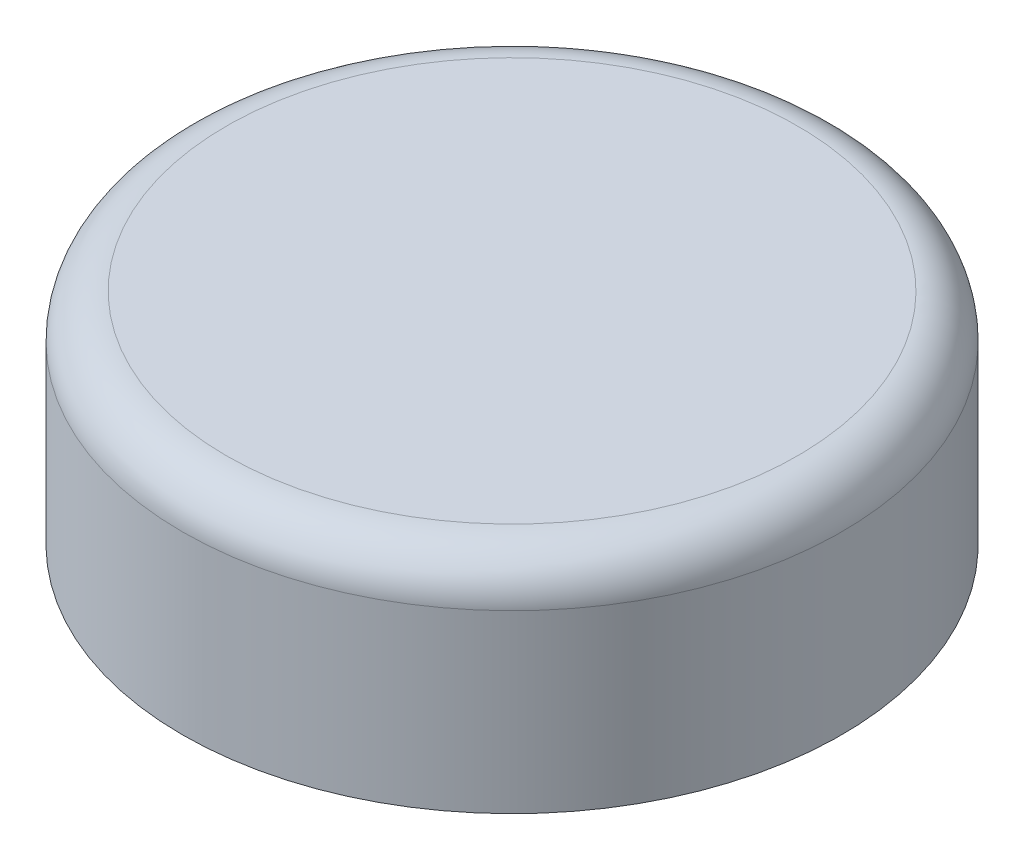
ISO-10303-21;
HEADER;
FILE_DESCRIPTION(('STEP AP214'),'2;1');
FILE_NAME('part.step','',(''),(''),'','','');
FILE_SCHEMA(('AUTOMOTIVE_DESIGN { 1 0 10303 214 1 1 1 1 }'));
ENDSEC;
DATA;
#1=APPLICATION_CONTEXT('core data for automotive mechanical design processes');
#2=APPLICATION_PROTOCOL_DEFINITION('international standard','automotive_design',2000,#1);
#3=PRODUCT_CONTEXT('',#1,'mechanical');
#4=PRODUCT('Part','Part','',(#3));
#5=PRODUCT_RELATED_PRODUCT_CATEGORY('part','',(#4));
#6=PRODUCT_DEFINITION_FORMATION('','',#4);
#7=PRODUCT_DEFINITION_CONTEXT('part definition',#1,'design');
#8=PRODUCT_DEFINITION('design','',#6,#7);
#9=PRODUCT_DEFINITION_SHAPE('','',#8);
#10=(LENGTH_UNIT() NAMED_UNIT(*) SI_UNIT(.MILLI.,.METRE.));
#11=(NAMED_UNIT(*) PLANE_ANGLE_UNIT() SI_UNIT($,.RADIAN.));
#12=(NAMED_UNIT(*) SI_UNIT($,.STERADIAN.) SOLID_ANGLE_UNIT());
#13=UNCERTAINTY_MEASURE_WITH_UNIT(LENGTH_MEASURE(1.E-05),#10,'distance_accuracy_value','');
#14=(GEOMETRIC_REPRESENTATION_CONTEXT(3) GLOBAL_UNCERTAINTY_ASSIGNED_CONTEXT((#13)) GLOBAL_UNIT_ASSIGNED_CONTEXT((#10,
#11,#12)) REPRESENTATION_CONTEXT('',''));
#15=CARTESIAN_POINT('',(0.,0.,0.));
#16=DIRECTION('',(0.,0.,1.));
#17=DIRECTION('',(1.,0.,0.));
#18=AXIS2_PLACEMENT_3D('',#15,#16,#17);
#19=CARTESIAN_POINT('',(0.,0.,0.));
#20=DIRECTION('',(0.,1.,0.));
#21=DIRECTION('',(0.,0.,1.));
#22=AXIS2_PLACEMENT_3D('',#19,#20,#21);
#23=PLANE('',#22);
#24=CARTESIAN_POINT('',(0.,0.,0.));
#25=DIRECTION('',(0.,1.,0.));
#26=DIRECTION('',(0.,0.,1.));
#27=AXIS2_PLACEMENT_3D('',#24,#25,#26);
#28=CIRCLE('',#27,15.);
#29=CARTESIAN_POINT('',(0.,0.,15.));
#30=VERTEX_POINT('',#29);
#31=EDGE_CURVE('E51',#30,#30,#28,.T.);
#32=ORIENTED_EDGE('',*,*,#31,.F.);
#33=EDGE_LOOP('',(#32));
#34=FACE_BOUND('',#33,.T.);
#35=CARTESIAN_POINT('',(0.,0.,0.));
#36=DIRECTION('',(0.,1.,0.));
#37=DIRECTION('',(0.,0.,1.));
#38=AXIS2_PLACEMENT_3D('',#35,#36,#37);
#39=CIRCLE('',#38,3.1);
#40=CARTESIAN_POINT('',(1.55,0.,-2.68467875173176));
#41=VERTEX_POINT('',#40);
#42=CARTESIAN_POINT('',(1.55,0.,2.68467875173176));
#43=VERTEX_POINT('',#42);
#44=EDGE_CURVE('E60',#41,#43,#39,.T.);
#45=ORIENTED_EDGE('',*,*,#44,.T.);
#46=DIRECTION('',(0.,0.,-1.));
#47=VECTOR('',#46,1.);
#48=CARTESIAN_POINT('',(1.55,0.,-2.68467875173176));
#49=LINE('',#48,#47);
#50=EDGE_CURVE('E75',#43,#41,#49,.T.);
#51=ORIENTED_EDGE('',*,*,#50,.T.);
#52=EDGE_LOOP('',(#45,#51));
#53=FACE_BOUND('',#52,.T.);
#54=ADVANCED_FACE('F42',(#34,#53),#23,.F.);
#55=CARTESIAN_POINT('',(0.,10.,0.));
#56=DIRECTION('',(0.,1.,0.));
#57=DIRECTION('',(0.,0.,1.));
#58=AXIS2_PLACEMENT_3D('',#55,#56,#57);
#59=CYLINDRICAL_SURFACE('',#58,15.);
#60=CARTESIAN_POINT('',(0.,8.,0.));
#61=DIRECTION('',(0.,1.,0.));
#62=DIRECTION('',(0.,0.,1.));
#63=AXIS2_PLACEMENT_3D('',#60,#61,#62);
#64=CIRCLE('',#63,15.);
#65=CARTESIAN_POINT('',(0.,8.,15.));
#66=VERTEX_POINT('',#65);
#67=EDGE_CURVE('E11',#66,#66,#64,.T.);
#68=ORIENTED_EDGE('',*,*,#67,.F.);
#69=EDGE_LOOP('',(#68));
#70=FACE_BOUND('',#69,.T.);
#71=ORIENTED_EDGE('',*,*,#31,.T.);
#72=EDGE_LOOP('',(#71));
#73=FACE_BOUND('',#72,.T.);
#74=ADVANCED_FACE('F102',(#70,#73),#59,.T.);
#75=CARTESIAN_POINT('',(0.,8.,0.));
#76=DIRECTION('',(0.,1.,0.));
#77=DIRECTION('',(0.,0.,1.));
#78=AXIS2_PLACEMENT_3D('',#75,#76,#77);
#79=TOROIDAL_SURFACE('',#78,13.,2.);
#80=CARTESIAN_POINT('',(0.,10.,0.));
#81=DIRECTION('',(0.,1.,0.));
#82=DIRECTION('',(0.,0.,1.));
#83=AXIS2_PLACEMENT_3D('',#80,#81,#82);
#84=CIRCLE('',#83,13.);
#85=CARTESIAN_POINT('',(0.,10.,13.));
#86=VERTEX_POINT('',#85);
#87=EDGE_CURVE('E87',#86,#86,#84,.T.);
#88=ORIENTED_EDGE('',*,*,#87,.F.);
#89=EDGE_LOOP('',(#88));
#90=FACE_BOUND('',#89,.T.);
#91=ORIENTED_EDGE('',*,*,#67,.T.);
#92=EDGE_LOOP('',(#91));
#93=FACE_BOUND('',#92,.T.);
#94=ADVANCED_FACE('F44',(#90,#93),#79,.T.);
#95=CARTESIAN_POINT('',(0.,10.,0.));
#96=DIRECTION('',(0.,-1.,0.));
#97=DIRECTION('',(0.,0.,-1.));
#98=AXIS2_PLACEMENT_3D('',#95,#96,#97);
#99=PLANE('',#98);
#100=ORIENTED_EDGE('',*,*,#87,.T.);
#101=EDGE_LOOP('',(#100));
#102=FACE_BOUND('',#101,.T.);
#103=ADVANCED_FACE('F106',(#102),#99,.F.);
#104=CARTESIAN_POINT('',(0.,7.5,0.));
#105=DIRECTION('',(0.,-1.,0.));
#106=DIRECTION('',(0.,0.,-1.));
#107=AXIS2_PLACEMENT_3D('',#104,#105,#106);
#108=CYLINDRICAL_SURFACE('',#107,3.1);
#109=ORIENTED_EDGE('',*,*,#44,.F.);
#110=DIRECTION('',(0.,-1.,0.));
#111=VECTOR('',#110,1.);
#112=CARTESIAN_POINT('',(1.55,7.5,-2.68467875173176));
#113=LINE('',#112,#111);
#114=CARTESIAN_POINT('',(1.55,7.5,-2.68467875173176));
#115=VERTEX_POINT('',#114);
#116=EDGE_CURVE('E78',#115,#41,#113,.T.);
#117=ORIENTED_EDGE('',*,*,#116,.F.);
#118=CARTESIAN_POINT('',(0.,7.5,0.));
#119=DIRECTION('',(0.,1.,0.));
#120=DIRECTION('',(0.,0.,1.));
#121=AXIS2_PLACEMENT_3D('',#118,#119,#120);
#122=CIRCLE('',#121,3.1);
#123=CARTESIAN_POINT('',(1.55,7.5,2.68467875173176));
#124=VERTEX_POINT('',#123);
#125=EDGE_CURVE('E81',#115,#124,#122,.T.);
#126=ORIENTED_EDGE('',*,*,#125,.T.);
#127=DIRECTION('',(0.,-1.,0.));
#128=VECTOR('',#127,1.);
#129=CARTESIAN_POINT('',(1.55,7.5,2.68467875173176));
#130=LINE('',#129,#128);
#131=EDGE_CURVE('E77',#124,#43,#130,.T.);
#132=ORIENTED_EDGE('',*,*,#131,.T.);
#133=EDGE_LOOP('',(#109,#117,#126,#132));
#134=FACE_BOUND('',#133,.T.);
#135=ADVANCED_FACE('F84',(#134),#108,.F.);
#136=CARTESIAN_POINT('',(1.55,7.5,-2.68467875173176));
#137=DIRECTION('',(-1.,0.,0.));
#138=DIRECTION('',(0.,0.,1.));
#139=AXIS2_PLACEMENT_3D('',#136,#137,#138);
#140=PLANE('',#139);
#141=ORIENTED_EDGE('',*,*,#50,.F.);
#142=ORIENTED_EDGE('',*,*,#131,.F.);
#143=DIRECTION('',(0.,0.,-1.));
#144=VECTOR('',#143,1.);
#145=CARTESIAN_POINT('',(1.55,7.5,-2.68467875173176));
#146=LINE('',#145,#144);
#147=EDGE_CURVE('E69',#124,#115,#146,.T.);
#148=ORIENTED_EDGE('',*,*,#147,.T.);
#149=ORIENTED_EDGE('',*,*,#116,.T.);
#150=EDGE_LOOP('',(#141,#142,#148,#149));
#151=FACE_BOUND('',#150,.T.);
#152=ADVANCED_FACE('F76',(#151),#140,.T.);
#153=CARTESIAN_POINT('',(0.,7.5,0.));
#154=DIRECTION('',(0.,1.,0.));
#155=DIRECTION('',(0.,0.,1.));
#156=AXIS2_PLACEMENT_3D('',#153,#154,#155);
#157=PLANE('',#156);
#158=ORIENTED_EDGE('',*,*,#125,.F.);
#159=ORIENTED_EDGE('',*,*,#147,.F.);
#160=EDGE_LOOP('',(#158,#159));
#161=FACE_BOUND('',#160,.T.);
#162=ADVANCED_FACE('F123',(#161),#157,.F.);
#163=CLOSED_SHELL('',(#54,#74,#94,#103,#135,#152,#162));
#164=MANIFOLD_SOLID_BREP('B2',#163);
#165=ADVANCED_BREP_SHAPE_REPRESENTATION('',(#18,#164),#14);
#166=SHAPE_DEFINITION_REPRESENTATION(#9,#165);
ENDSEC;
END-ISO-10303-21;
